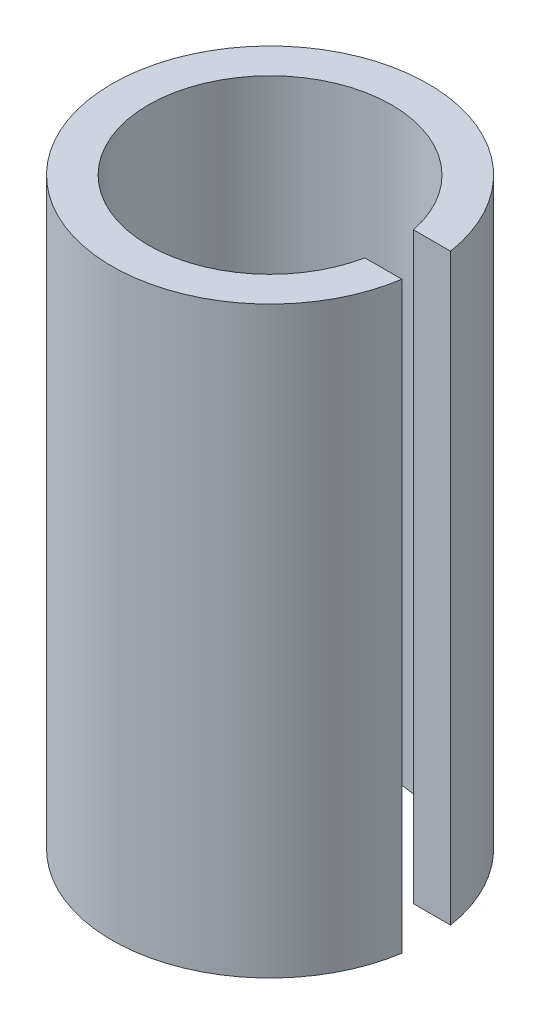
ISO-10303-21;
HEADER;
FILE_DESCRIPTION(('STEP AP214'),'2;1');
FILE_NAME('part.step','',(''),(''),'','','');
FILE_SCHEMA(('AUTOMOTIVE_DESIGN { 1 0 10303 214 1 1 1 1 }'));
ENDSEC;
DATA;
#1=APPLICATION_CONTEXT('core data for automotive mechanical design processes');
#2=APPLICATION_PROTOCOL_DEFINITION('international standard','automotive_design',2000,#1);
#3=PRODUCT_CONTEXT('',#1,'mechanical');
#4=PRODUCT('Part','Part','',(#3));
#5=PRODUCT_RELATED_PRODUCT_CATEGORY('part','',(#4));
#6=PRODUCT_DEFINITION_FORMATION('','',#4);
#7=PRODUCT_DEFINITION_CONTEXT('part definition',#1,'design');
#8=PRODUCT_DEFINITION('design','',#6,#7);
#9=PRODUCT_DEFINITION_SHAPE('','',#8);
#10=(LENGTH_UNIT() NAMED_UNIT(*) SI_UNIT(.MILLI.,.METRE.));
#11=(NAMED_UNIT(*) PLANE_ANGLE_UNIT() SI_UNIT($,.RADIAN.));
#12=(NAMED_UNIT(*) SI_UNIT($,.STERADIAN.) SOLID_ANGLE_UNIT());
#13=UNCERTAINTY_MEASURE_WITH_UNIT(LENGTH_MEASURE(1.E-05),#10,'distance_accuracy_value','');
#14=(GEOMETRIC_REPRESENTATION_CONTEXT(3) GLOBAL_UNCERTAINTY_ASSIGNED_CONTEXT((#13)) GLOBAL_UNIT_ASSIGNED_CONTEXT((#10,
#11,#12)) REPRESENTATION_CONTEXT('',''));
#15=CARTESIAN_POINT('',(0.,0.,0.));
#16=DIRECTION('',(0.,0.,1.));
#17=DIRECTION('',(1.,0.,0.));
#18=AXIS2_PLACEMENT_3D('',#15,#16,#17);
#19=CARTESIAN_POINT('',(0.,12.,0.));
#20=DIRECTION('',(0.,-1.,0.));
#21=DIRECTION('',(0.,0.,-1.));
#22=AXIS2_PLACEMENT_3D('',#19,#20,#21);
#23=CYLINDRICAL_SURFACE('',#22,2.5);
#24=CARTESIAN_POINT('',(0.,0.,0.));
#25=DIRECTION('',(0.,1.,0.));
#26=DIRECTION('',(0.,0.,1.));
#27=AXIS2_PLACEMENT_3D('',#24,#25,#26);
#28=CIRCLE('',#27,2.5);
#29=CARTESIAN_POINT('',(2.44948974278318,0.,-0.5));
#30=VERTEX_POINT('',#29);
#31=CARTESIAN_POINT('',(2.44948974278318,0.,0.5));
#32=VERTEX_POINT('',#31);
#33=EDGE_CURVE('E104',#30,#32,#28,.T.);
#34=ORIENTED_EDGE('',*,*,#33,.F.);
#35=DIRECTION('',(0.,-1.,0.));
#36=VECTOR('',#35,1.);
#37=CARTESIAN_POINT('',(2.44948974278318,12.,-0.5));
#38=LINE('',#37,#36);
#39=CARTESIAN_POINT('',(2.44948974278318,12.,-0.5));
#40=VERTEX_POINT('',#39);
#41=EDGE_CURVE('E11',#40,#30,#38,.T.);
#42=ORIENTED_EDGE('',*,*,#41,.F.);
#43=CARTESIAN_POINT('',(0.,12.,0.));
#44=DIRECTION('',(0.,1.,0.));
#45=DIRECTION('',(0.,0.,1.));
#46=AXIS2_PLACEMENT_3D('',#43,#44,#45);
#47=CIRCLE('',#46,2.5);
#48=CARTESIAN_POINT('',(2.44948974278318,12.,0.5));
#49=VERTEX_POINT('',#48);
#50=EDGE_CURVE('E89',#40,#49,#47,.T.);
#51=ORIENTED_EDGE('',*,*,#50,.T.);
#52=DIRECTION('',(0.,-1.,0.));
#53=VECTOR('',#52,1.);
#54=CARTESIAN_POINT('',(2.44948974278318,12.,0.5));
#55=LINE('',#54,#53);
#56=EDGE_CURVE('E57',#49,#32,#55,.T.);
#57=ORIENTED_EDGE('',*,*,#56,.T.);
#58=EDGE_LOOP('',(#34,#42,#51,#57));
#59=FACE_BOUND('',#58,.T.);
#60=ADVANCED_FACE('F41',(#59),#23,.F.);
#61=CARTESIAN_POINT('',(0.,12.,-0.5));
#62=DIRECTION('',(0.,0.,-1.));
#63=DIRECTION('',(-1.,0.,0.));
#64=AXIS2_PLACEMENT_3D('',#61,#62,#63);
#65=PLANE('',#64);
#66=DIRECTION('',(1.,0.,0.));
#67=VECTOR('',#66,1.);
#68=CARTESIAN_POINT('',(0.,0.,-0.5));
#69=LINE('',#68,#67);
#70=CARTESIAN_POINT('',(3.21130814466628,0.,-0.5));
#71=VERTEX_POINT('',#70);
#72=EDGE_CURVE('E95',#30,#71,#69,.T.);
#73=ORIENTED_EDGE('',*,*,#72,.T.);
#74=DIRECTION('',(0.,-1.,0.));
#75=VECTOR('',#74,1.);
#76=CARTESIAN_POINT('',(3.21130814466628,12.,-0.5));
#77=LINE('',#76,#75);
#78=CARTESIAN_POINT('',(3.21130814466628,12.,-0.5));
#79=VERTEX_POINT('',#78);
#80=EDGE_CURVE('E49',#79,#71,#77,.T.);
#81=ORIENTED_EDGE('',*,*,#80,.F.);
#82=DIRECTION('',(1.,0.,0.));
#83=VECTOR('',#82,1.);
#84=CARTESIAN_POINT('',(0.,12.,-0.5));
#85=LINE('',#84,#83);
#86=EDGE_CURVE('E83',#40,#79,#85,.T.);
#87=ORIENTED_EDGE('',*,*,#86,.F.);
#88=ORIENTED_EDGE('',*,*,#41,.T.);
#89=EDGE_LOOP('',(#73,#81,#87,#88));
#90=FACE_BOUND('',#89,.T.);
#91=ADVANCED_FACE('F93',(#90),#65,.F.);
#92=CARTESIAN_POINT('',(0.,12.,0.));
#93=DIRECTION('',(0.,-1.,0.));
#94=DIRECTION('',(0.,0.,-1.));
#95=AXIS2_PLACEMENT_3D('',#92,#93,#94);
#96=CYLINDRICAL_SURFACE('',#95,3.25);
#97=CARTESIAN_POINT('',(0.,0.,0.));
#98=DIRECTION('',(0.,1.,0.));
#99=DIRECTION('',(0.,0.,1.));
#100=AXIS2_PLACEMENT_3D('',#97,#98,#99);
#101=CIRCLE('',#100,3.25);
#102=CARTESIAN_POINT('',(3.21130814466628,0.,0.5));
#103=VERTEX_POINT('',#102);
#104=EDGE_CURVE('E107',#71,#103,#101,.T.);
#105=ORIENTED_EDGE('',*,*,#104,.T.);
#106=DIRECTION('',(0.,-1.,0.));
#107=VECTOR('',#106,1.);
#108=CARTESIAN_POINT('',(3.21130814466628,12.,0.5));
#109=LINE('',#108,#107);
#110=CARTESIAN_POINT('',(3.21130814466628,12.,0.5));
#111=VERTEX_POINT('',#110);
#112=EDGE_CURVE('E71',#111,#103,#109,.T.);
#113=ORIENTED_EDGE('',*,*,#112,.F.);
#114=CARTESIAN_POINT('',(0.,12.,0.));
#115=DIRECTION('',(0.,1.,0.));
#116=DIRECTION('',(0.,0.,1.));
#117=AXIS2_PLACEMENT_3D('',#114,#115,#116);
#118=CIRCLE('',#117,3.25);
#119=EDGE_CURVE('E88',#79,#111,#118,.T.);
#120=ORIENTED_EDGE('',*,*,#119,.F.);
#121=ORIENTED_EDGE('',*,*,#80,.T.);
#122=EDGE_LOOP('',(#105,#113,#120,#121));
#123=FACE_BOUND('',#122,.T.);
#124=ADVANCED_FACE('F98',(#123),#96,.T.);
#125=CARTESIAN_POINT('',(0.,12.,0.5));
#126=DIRECTION('',(0.,0.,-1.));
#127=DIRECTION('',(-1.,0.,0.));
#128=AXIS2_PLACEMENT_3D('',#125,#126,#127);
#129=PLANE('',#128);
#130=DIRECTION('',(1.,0.,0.));
#131=VECTOR('',#130,1.);
#132=CARTESIAN_POINT('',(0.,0.,0.5));
#133=LINE('',#132,#131);
#134=EDGE_CURVE('E109',#32,#103,#133,.T.);
#135=ORIENTED_EDGE('',*,*,#134,.F.);
#136=ORIENTED_EDGE('',*,*,#56,.F.);
#137=DIRECTION('',(1.,0.,0.));
#138=VECTOR('',#137,1.);
#139=CARTESIAN_POINT('',(0.,12.,0.5));
#140=LINE('',#139,#138);
#141=EDGE_CURVE('E99',#49,#111,#140,.T.);
#142=ORIENTED_EDGE('',*,*,#141,.T.);
#143=ORIENTED_EDGE('',*,*,#112,.T.);
#144=EDGE_LOOP('',(#135,#136,#142,#143));
#145=FACE_BOUND('',#144,.T.);
#146=ADVANCED_FACE('F114',(#145),#129,.T.);
#147=CARTESIAN_POINT('',(0.,12.,0.));
#148=DIRECTION('',(0.,1.,0.));
#149=DIRECTION('',(0.,0.,1.));
#150=AXIS2_PLACEMENT_3D('',#147,#148,#149);
#151=PLANE('',#150);
#152=ORIENTED_EDGE('',*,*,#50,.F.);
#153=ORIENTED_EDGE('',*,*,#86,.T.);
#154=ORIENTED_EDGE('',*,*,#119,.T.);
#155=ORIENTED_EDGE('',*,*,#141,.F.);
#156=EDGE_LOOP('',(#152,#153,#154,#155));
#157=FACE_BOUND('',#156,.T.);
#158=ADVANCED_FACE('F85',(#157),#151,.T.);
#159=CARTESIAN_POINT('',(0.,0.,0.));
#160=DIRECTION('',(0.,1.,0.));
#161=DIRECTION('',(0.,0.,1.));
#162=AXIS2_PLACEMENT_3D('',#159,#160,#161);
#163=PLANE('',#162);
#164=ORIENTED_EDGE('',*,*,#33,.T.);
#165=ORIENTED_EDGE('',*,*,#134,.T.);
#166=ORIENTED_EDGE('',*,*,#104,.F.);
#167=ORIENTED_EDGE('',*,*,#72,.F.);
#168=EDGE_LOOP('',(#164,#165,#166,#167));
#169=FACE_BOUND('',#168,.T.);
#170=ADVANCED_FACE('F121',(#169),#163,.F.);
#171=CLOSED_SHELL('',(#60,#91,#124,#146,#158,#170));
#172=MANIFOLD_SOLID_BREP('B2',#171);
#173=ADVANCED_BREP_SHAPE_REPRESENTATION('',(#18,#172),#14);
#174=SHAPE_DEFINITION_REPRESENTATION(#9,#173);
ENDSEC;
END-ISO-10303-21;
